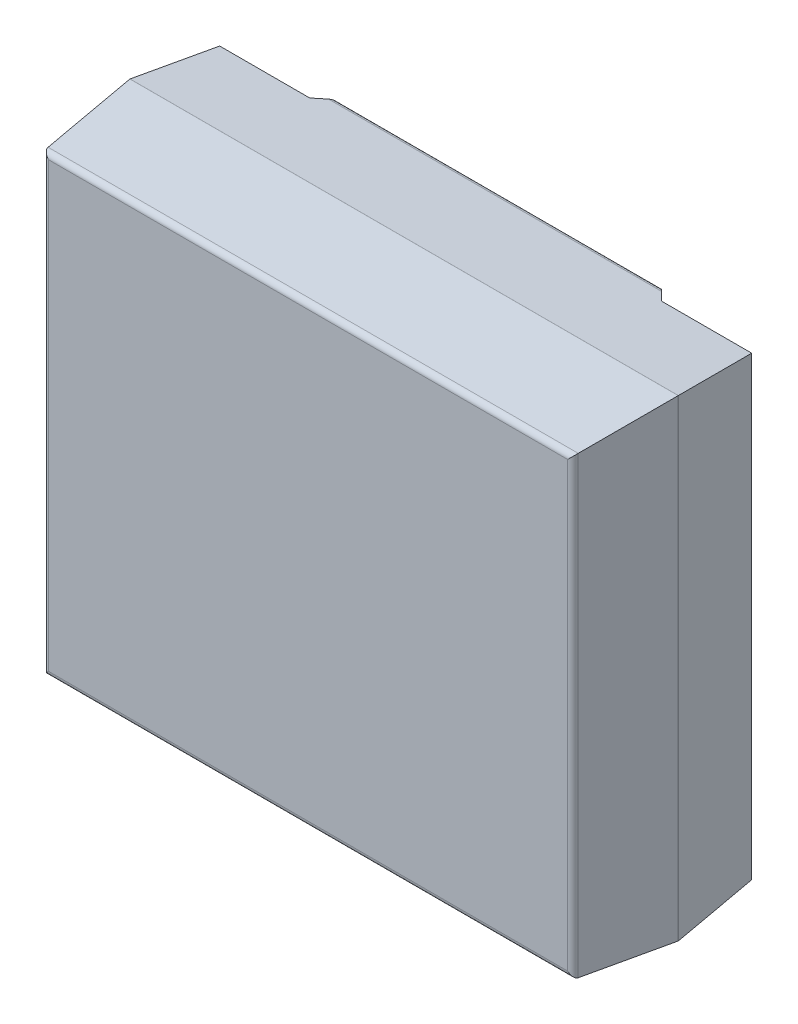
ISO-10303-21;
HEADER;
FILE_DESCRIPTION(('STEP AP214'),'2;1');
FILE_NAME('part.step','',(''),(''),'','','');
FILE_SCHEMA(('AUTOMOTIVE_DESIGN { 1 0 10303 214 1 1 1 1 }'));
ENDSEC;
DATA;
#1=APPLICATION_CONTEXT('core data for automotive mechanical design processes');
#2=APPLICATION_PROTOCOL_DEFINITION('international standard','automotive_design',2000,#1);
#3=PRODUCT_CONTEXT('',#1,'mechanical');
#4=PRODUCT('Part','Part','',(#3));
#5=PRODUCT_RELATED_PRODUCT_CATEGORY('part','',(#4));
#6=PRODUCT_DEFINITION_FORMATION('','',#4);
#7=PRODUCT_DEFINITION_CONTEXT('part definition',#1,'design');
#8=PRODUCT_DEFINITION('design','',#6,#7);
#9=PRODUCT_DEFINITION_SHAPE('','',#8);
#10=(LENGTH_UNIT() NAMED_UNIT(*) SI_UNIT(.MILLI.,.METRE.));
#11=(NAMED_UNIT(*) PLANE_ANGLE_UNIT() SI_UNIT($,.RADIAN.));
#12=(NAMED_UNIT(*) SI_UNIT($,.STERADIAN.) SOLID_ANGLE_UNIT());
#13=UNCERTAINTY_MEASURE_WITH_UNIT(LENGTH_MEASURE(1.E-05),#10,'distance_accuracy_value','');
#14=(GEOMETRIC_REPRESENTATION_CONTEXT(3) GLOBAL_UNCERTAINTY_ASSIGNED_CONTEXT((#13)) GLOBAL_UNIT_ASSIGNED_CONTEXT((#10,
#11,#12)) REPRESENTATION_CONTEXT('',''));
#15=CARTESIAN_POINT('',(0.,0.,0.));
#16=DIRECTION('',(0.,0.,1.));
#17=DIRECTION('',(1.,0.,0.));
#18=AXIS2_PLACEMENT_3D('',#15,#16,#17);
#19=CARTESIAN_POINT('',(91.200001657114,18.50000079233,0.28));
#20=DIRECTION('',(-0.707106781187046,-6.1817238459324E-08,0.707106781186046));
#21=DIRECTION('',(0.707106781186048,0.,0.707106781187047));
#22=AXIS2_PLACEMENT_3D('',#19,#20,#21);
#23=PLANE('',#22);
#24=DIRECTION('',(0.,1.,0.));
#25=VECTOR('',#24,1.);
#26=CARTESIAN_POINT('',(91.020001462091,20.547500899642,0.1));
#27=LINE('',#26,#25);
#28=CARTESIAN_POINT('',(91.0200014620913,20.730799729348,0.1));
#29=VERTEX_POINT('',#28);
#30=CARTESIAN_POINT('',(91.0200012200001,26.2692016472461,0.1));
#31=VERTEX_POINT('',#30);
#32=EDGE_CURVE('E135',#29,#31,#27,.T.);
#33=ORIENTED_EDGE('',*,*,#32,.T.);
#34=CARTESIAN_POINT('',(91.0900009779091,26.2692016533658,0.17));
#35=DIRECTION('',(-0.707106781187046,-6.1817238459324E-08,0.707106781186046));
#36=DIRECTION('',(0.707106781186044,6.18172378312038E-08,0.707106781187049));
#37=AXIS2_PLACEMENT_3D('',#34,#35,#36);
#38=ELLIPSE('',#37,0.0989949493660465,0.07);
#39=CARTESIAN_POINT('',(91.0830356934585,26.3388542542686,0.16303472163874));
#40=VERTEX_POINT('',#39);
#41=EDGE_CURVE('E20',#40,#31,#38,.T.);
#42=ORIENTED_EDGE('',*,*,#41,.F.);
#43=DIRECTION('',(-0.705345609691911,-0.0705346232461147,-0.705345615859258));
#44=VECTOR('',#43,1.);
#45=CARTESIAN_POINT('',(91.2000009707971,26.35055079233,0.279999999999937));
#46=LINE('',#45,#44);
#47=CARTESIAN_POINT('',(91.2000010538647,26.3505508662361,0.280000083067648));
#48=VERTEX_POINT('',#47);
#49=EDGE_CURVE('E109',#48,#40,#46,.T.);
#50=ORIENTED_EDGE('',*,*,#49,.F.);
#51=DIRECTION('',(0.,-1.,0.));
#52=VECTOR('',#51,1.);
#53=CARTESIAN_POINT('',(91.200000970797,18.500000949691,0.28));
#54=LINE('',#53,#52);
#55=CARTESIAN_POINT('',(91.2000012998202,20.6494507929799,0.279999996752506));
#56=VERTEX_POINT('',#55);
#57=EDGE_CURVE('E186',#48,#56,#54,.T.);
#58=ORIENTED_EDGE('',*,*,#57,.T.);
#59=DIRECTION('',(0.705345622024334,-0.0705344999244135,0.705345615859004));
#60=VECTOR('',#59,1.);
#61=CARTESIAN_POINT('',(91.0830362078494,20.661147308138,0.163034739668631));
#62=LINE('',#61,#60);
#63=CARTESIAN_POINT('',(91.0830362078494,20.6611473081379,0.163034739668682));
#64=VERTEX_POINT('',#63);
#65=EDGE_CURVE('E121',#64,#56,#62,.T.);
#66=ORIENTED_EDGE('',*,*,#65,.F.);
#67=CARTESIAN_POINT('',(91.0900014620915,20.7307999120614,0.17));
#68=DIRECTION('',(-0.707106781187046,-6.1817238459324E-08,0.707106781186046));
#69=DIRECTION('',(-0.707106781186044,-6.18172378312038E-08,-0.707106781187049));
#70=AXIS2_PLACEMENT_3D('',#67,#68,#69);
#71=ELLIPSE('',#70,0.0989949493660465,0.07);
#72=EDGE_CURVE('E184',#29,#64,#71,.T.);
#73=ORIENTED_EDGE('',*,*,#72,.F.);
#74=EDGE_LOOP('',(#33,#42,#50,#58,#66,#73));
#75=FACE_BOUND('',#74,.T.);
#76=ADVANCED_FACE('F17',(#75),#23,.F.);
#77=CARTESIAN_POINT('',(92.427501478116,20.547500899642,0.1));
#78=DIRECTION('',(0.,0.,1.));
#79=DIRECTION('',(1.,0.,0.));
#80=AXIS2_PLACEMENT_3D('',#77,#78,#79);
#81=PLANE('',#80);
#82=DIRECTION('',(0.999999999999996,8.74227765734797E-08,0.));
#83=VECTOR('',#82,1.);
#84=CARTESIAN_POINT('',(85.692450977909,26.2692011814968,0.1));
#85=LINE('',#84,#83);
#86=CARTESIAN_POINT('',(86.9800010989547,26.2692012925282,0.0999999394772857));
#87=VERTEX_POINT('',#86);
#88=EDGE_CURVE('E183',#31,#87,#85,.F.);
#89=ORIENTED_EDGE('',*,*,#88,.F.);
#90=ORIENTED_EDGE('',*,*,#32,.F.);
#91=DIRECTION('',(-0.999999999999996,-8.74227765734797E-08,0.));
#92=VECTOR('',#91,1.);
#93=CARTESIAN_POINT('',(92.307551462091,20.7308000185032,0.1));
#94=LINE('',#93,#92);
#95=CARTESIAN_POINT('',(86.9800014620916,20.730799551224,0.100000000000093));
#96=VERTEX_POINT('',#95);
#97=EDGE_CURVE('E187',#96,#29,#94,.F.);
#98=ORIENTED_EDGE('',*,*,#97,.F.);
#99=DIRECTION('',(-4.37113880647605E-08,0.999999999999998,-4.37113880646987E-08));
#100=VECTOR('',#99,1.);
#101=CARTESIAN_POINT('',(86.9800015596027,18.500000447456,0.100000097511696));
#102=LINE('',#101,#100);
#103=EDGE_CURVE('E139',#96,#87,#102,.T.);
#104=ORIENTED_EDGE('',*,*,#103,.T.);
#105=EDGE_LOOP('',(#89,#90,#98,#104));
#106=FACE_BOUND('',#105,.T.);
#107=ADVANCED_FACE('F542',(#106),#81,.F.);
#108=CARTESIAN_POINT('',(87.255099810316,18.500000447456,-0.175098153202));
#109=DIRECTION('',(0.707106781187046,6.1817237831294E-08,0.707106781186046));
#110=DIRECTION('',(0.707106781186048,0.,-0.707106781187047));
#111=AXIS2_PLACEMENT_3D('',#108,#109,#110);
#112=PLANE('',#111);
#113=CARTESIAN_POINT('',(86.9100009779094,26.2692012879386,0.17));
#114=DIRECTION('',(0.707106781187046,6.1817237831294E-08,0.707106781186046));
#115=DIRECTION('',(0.707106781186044,6.18172384592338E-08,-0.707106781187049));
#116=AXIS2_PLACEMENT_3D('',#113,#114,#115);
#117=ELLIPSE('',#116,0.0989949493660465,0.07);
#118=CARTESIAN_POINT('',(86.9169662321514,26.3388538918621,0.163034739668697));
#119=VERTEX_POINT('',#118);
#120=EDGE_CURVE('E130',#87,#119,#117,.T.);
#121=ORIENTED_EDGE('',*,*,#120,.F.);
#122=ORIENTED_EDGE('',*,*,#103,.F.);
#123=CARTESIAN_POINT('',(86.9100014620918,20.7307995466342,0.17));
#124=DIRECTION('',(0.707106781187046,6.1817237831294E-08,0.707106781186046));
#125=DIRECTION('',(-0.707106781186044,-6.18172384592338E-08,0.707106781187049));
#126=AXIS2_PLACEMENT_3D('',#123,#124,#125);
#127=ELLIPSE('',#126,0.0989949493660465,0.07);
#128=CARTESIAN_POINT('',(86.9169667465423,20.6611469457314,0.163034721638741));
#129=VERTEX_POINT('',#128);
#130=EDGE_CURVE('E188',#129,#96,#127,.T.);
#131=ORIENTED_EDGE('',*,*,#130,.F.);
#132=DIRECTION('',(0.705345609691932,0.0705346232461084,-0.705345615859237));
#133=VECTOR('',#132,1.);
#134=CARTESIAN_POINT('',(86.8000014692034,20.64945040767,0.280000000000383));
#135=LINE('',#134,#133);
#136=CARTESIAN_POINT('',(86.8000013861355,20.6494503665637,0.280000083067804));
#137=VERTEX_POINT('',#136);
#138=EDGE_CURVE('E137',#137,#129,#135,.T.);
#139=ORIENTED_EDGE('',*,*,#138,.F.);
#140=DIRECTION('',(0.,-1.,0.));
#141=VECTOR('',#140,1.);
#142=CARTESIAN_POINT('',(86.800001469203,18.50000040767,0.28));
#143=LINE('',#142,#141);
#144=CARTESIAN_POINT('',(86.80000114018,26.3505504070201,0.279999996752655));
#145=VERTEX_POINT('',#144);
#146=EDGE_CURVE('E182',#137,#145,#143,.F.);
#147=ORIENTED_EDGE('',*,*,#146,.T.);
#148=DIRECTION('',(-0.705345622024326,0.0705344999243709,0.705345615859017));
#149=VECTOR('',#148,1.);
#150=CARTESIAN_POINT('',(86.9169662321511,26.338853891862,0.163034739669071));
#151=LINE('',#150,#149);
#152=EDGE_CURVE('E190',#119,#145,#151,.T.);
#153=ORIENTED_EDGE('',*,*,#152,.F.);
#154=EDGE_LOOP('',(#121,#122,#131,#139,#147,#153));
#155=FACE_BOUND('',#154,.T.);
#156=ADVANCED_FACE('F534',(#155),#112,.F.);
#157=CARTESIAN_POINT('',(92.307551462091,20.730800018503,0.17));
#158=DIRECTION('',(-0.999999999999996,-8.74227765734797E-08,0.));
#159=DIRECTION('',(8.74227765734797E-08,-0.999999999999996,0.));
#160=AXIS2_PLACEMENT_3D('',#157,#158,#159);
#161=CYLINDRICAL_SURFACE('',#160,0.07);
#162=ORIENTED_EDGE('',*,*,#72,.T.);
#163=DIRECTION('',(0.999999999999996,8.65572045281956E-08,8.65572045281956E-09));
#164=VECTOR('',#163,1.);
#165=CARTESIAN_POINT('',(92.427501472873,20.6611474245114,0.163034751306337));
#166=LINE('',#165,#164);
#167=EDGE_CURVE('E206',#64,#129,#166,.F.);
#168=ORIENTED_EDGE('',*,*,#167,.T.);
#169=ORIENTED_EDGE('',*,*,#130,.T.);
#170=ORIENTED_EDGE('',*,*,#97,.T.);
#171=EDGE_LOOP('',(#162,#168,#169,#170));
#172=FACE_BOUND('',#171,.T.);
#173=ADVANCED_FACE('F526',(#172),#161,.T.);
#174=CARTESIAN_POINT('',(93.000001657114,18.500000949691,0.28));
#175=DIRECTION('',(0.,0.,1.));
#176=DIRECTION('',(0.,-1.,0.));
#177=AXIS2_PLACEMENT_3D('',#174,#175,#176);
#178=PLANE('',#177);
#179=DIRECTION('',(-8.65572045281956E-08,0.999999999999996,8.65572045281956E-09));
#180=VECTOR('',#179,1.);
#181=CARTESIAN_POINT('',(92.3255509619722,26.452500894398,0.280000000882477));
#182=LINE('',#181,#180);
#183=CARTESIAN_POINT('',(92.3255511366075,26.3505508900791,0.279999996752539));
#184=VERTEX_POINT('',#183);
#185=CARTESIAN_POINT('',(92.325551464268,20.6494508940189,0.27999996710194));
#186=VERTEX_POINT('',#185);
#187=EDGE_CURVE('E223',#184,#186,#182,.F.);
#188=ORIENTED_EDGE('',*,*,#187,.T.);
#189=DIRECTION('',(0.999999999999996,8.65572045281956E-08,8.65572045281956E-09));
#190=VECTOR('',#189,1.);
#191=CARTESIAN_POINT('',(92.427501472873,20.6494508995538,0.280000000882475));
#192=LINE('',#191,#190);
#193=EDGE_CURVE('E208',#186,#56,#192,.F.);
#194=ORIENTED_EDGE('',*,*,#193,.T.);
#195=ORIENTED_EDGE('',*,*,#57,.F.);
#196=DIRECTION('',(1.,0.,0.));
#197=VECTOR('',#196,1.);
#198=CARTESIAN_POINT('',(93.000001657114,26.350550890729,0.280000000000004));
#199=LINE('',#198,#197);
#200=EDGE_CURVE('E116',#184,#48,#199,.F.);
#201=ORIENTED_EDGE('',*,*,#200,.F.);
#202=EDGE_LOOP('',(#188,#194,#195,#201));
#203=FACE_BOUND('',#202,.T.);
#204=ADVANCED_FACE('F358',(#203),#178,.F.);
#205=CARTESIAN_POINT('',(85.692450977909,26.269201181497,0.17));
#206=DIRECTION('',(0.999999999999996,8.74227765734797E-08,0.));
#207=DIRECTION('',(-8.74227765734797E-08,0.999999999999996,0.));
#208=AXIS2_PLACEMENT_3D('',#205,#206,#207);
#209=CYLINDRICAL_SURFACE('',#208,0.07);
#210=DIRECTION('',(0.999999999999996,8.65572045281956E-08,-8.65572045281956E-09));
#211=VECTOR('',#210,1.);
#212=CARTESIAN_POINT('',(85.572500967127,26.3388537754886,0.163034751306337));
#213=LINE('',#212,#211);
#214=EDGE_CURVE('E114',#119,#40,#213,.T.);
#215=ORIENTED_EDGE('',*,*,#214,.T.);
#216=ORIENTED_EDGE('',*,*,#41,.T.);
#217=ORIENTED_EDGE('',*,*,#88,.T.);
#218=ORIENTED_EDGE('',*,*,#120,.T.);
#219=EDGE_LOOP('',(#215,#216,#217,#218));
#220=FACE_BOUND('',#219,.T.);
#221=ADVANCED_FACE('F126',(#220),#209,.T.);
#222=CARTESIAN_POINT('',(86.800001657114,18.50000040767,0.28));
#223=DIRECTION('',(0.,0.,1.));
#224=DIRECTION('',(0.,-1.,0.));
#225=AXIS2_PLACEMENT_3D('',#222,#223,#224);
#226=PLANE('',#225);
#227=DIRECTION('',(0.999999999999996,8.65572045281956E-08,-8.65572045281956E-09));
#228=VECTOR('',#227,1.);
#229=CARTESIAN_POINT('',(85.572500967127,26.3505503004462,0.280000000882476));
#230=LINE('',#229,#228);
#231=CARTESIAN_POINT('',(85.674450975732,26.3505503059811,0.279999967101939));
#232=VERTEX_POINT('',#231);
#233=EDGE_CURVE('E132',#232,#145,#230,.T.);
#234=ORIENTED_EDGE('',*,*,#233,.T.);
#235=ORIENTED_EDGE('',*,*,#146,.F.);
#236=DIRECTION('',(0.999999999999996,8.65572045281956E-08,8.65572045281956E-09));
#237=VECTOR('',#236,1.);
#238=CARTESIAN_POINT('',(92.427501472873,20.649450894771,0.280000048710099));
#239=LINE('',#238,#237);
#240=CARTESIAN_POINT('',(85.6744514695279,20.649450309596,0.279999996752545));
#241=VERTEX_POINT('',#240);
#242=EDGE_CURVE('E207',#137,#241,#239,.F.);
#243=ORIENTED_EDGE('',*,*,#242,.T.);
#244=DIRECTION('',(-8.65572045281956E-08,0.999999999999996,-8.65572045281956E-09));
#245=VECTOR('',#244,1.);
#246=CARTESIAN_POINT('',(85.6744514780277,20.547500305602,0.280000000882475));
#247=LINE('',#246,#245);
#248=EDGE_CURVE('E233',#241,#232,#247,.T.);
#249=ORIENTED_EDGE('',*,*,#248,.T.);
#250=EDGE_LOOP('',(#234,#235,#243,#249));
#251=FACE_BOUND('',#250,.T.);
#252=ADVANCED_FACE('F504',(#251),#226,.F.);
#253=CARTESIAN_POINT('',(92.427501472873,20.607475899642,0.69975));
#254=DIRECTION('',(-8.69889139620287E-08,0.995037190209985,0.0995037190209985));
#255=DIRECTION('',(0.,-0.0995037190209989,0.995037190209989));
#256=AXIS2_PLACEMENT_3D('',#253,#254,#255);
#257=PLANE('',#256);
#258=DIRECTION('',(0.999999999999996,8.74227765734797E-08,0.));
#259=VECTOR('',#258,1.);
#260=CARTESIAN_POINT('',(92.427501478116,20.547500899642,1.2995));
#261=LINE('',#260,#259);
#262=CARTESIAN_POINT('',(85.572501478116,20.5475003003584,1.29949999999999));
#263=VERTEX_POINT('',#262);
#264=CARTESIAN_POINT('',(92.4275014781155,20.547500899642,1.29950000000003));
#265=VERTEX_POINT('',#264);
#266=EDGE_CURVE('E180',#263,#265,#261,.T.);
#267=ORIENTED_EDGE('',*,*,#266,.F.);
#268=DIRECTION('',(0.0990147456415188,0.0990147629540551,-0.990147542976651));
#269=VECTOR('',#268,1.);
#270=CARTESIAN_POINT('',(85.572501478116,20.547500300358,1.2995));
#271=LINE('',#270,#269);
#272=EDGE_CURVE('E237',#263,#241,#271,.T.);
#273=ORIENTED_EDGE('',*,*,#272,.T.);
#274=ORIENTED_EDGE('',*,*,#242,.F.);
#275=ORIENTED_EDGE('',*,*,#138,.T.);
#276=ORIENTED_EDGE('',*,*,#167,.F.);
#277=ORIENTED_EDGE('',*,*,#65,.T.);
#278=ORIENTED_EDGE('',*,*,#193,.F.);
#279=DIRECTION('',(0.0990147629538225,-0.0990147456412828,0.990147542976697));
#280=VECTOR('',#279,1.);
#281=CARTESIAN_POINT('',(92.3255514692027,20.649450890729,0.280000000000026));
#282=LINE('',#281,#280);
#283=EDGE_CURVE('E226',#186,#265,#282,.T.);
#284=ORIENTED_EDGE('',*,*,#283,.T.);
#285=EDGE_LOOP('',(#267,#273,#274,#275,#276,#277,#278,#284));
#286=FACE_BOUND('',#285,.T.);
#287=ADVANCED_FACE('F341',(#286),#257,.F.);
#288=CARTESIAN_POINT('',(92.367525961884,26.452500894398,0.69975));
#289=DIRECTION('',(-0.995037190209985,-8.69889139620287E-08,0.0995037190209985));
#290=DIRECTION('',(0.0995037190209989,0.,0.995037190209989));
#291=AXIS2_PLACEMENT_3D('',#288,#289,#290);
#292=PLANE('',#291);
#293=DIRECTION('',(-8.74227765734797E-08,0.999999999999996,0.));
#294=VECTOR('',#293,1.);
#295=CARTESIAN_POINT('',(92.427500961884,26.452500899642,1.2995));
#296=LINE('',#295,#294);
#297=CARTESIAN_POINT('',(92.427500961884,26.4525008996411,1.29950000000003));
#298=VERTEX_POINT('',#297);
#299=EDGE_CURVE('E176',#265,#298,#296,.T.);
#300=ORIENTED_EDGE('',*,*,#299,.F.);
#301=ORIENTED_EDGE('',*,*,#283,.F.);
#302=ORIENTED_EDGE('',*,*,#187,.F.);
#303=DIRECTION('',(0.0990147456412764,0.0990147629538126,0.990147542976699));
#304=VECTOR('',#303,1.);
#305=CARTESIAN_POINT('',(92.325550970797,26.3505508907284,0.280000000000062));
#306=LINE('',#305,#304);
#307=EDGE_CURVE('E131',#184,#298,#306,.T.);
#308=ORIENTED_EDGE('',*,*,#307,.T.);
#309=EDGE_LOOP('',(#300,#301,#302,#308));
#310=FACE_BOUND('',#309,.T.);
#311=ADVANCED_FACE('F361',(#310),#292,.F.);
#312=CARTESIAN_POINT('',(85.572500967127,26.392525300358,0.69975));
#313=DIRECTION('',(8.69889139620287E-08,-0.995037190209985,0.0995037190209985));
#314=DIRECTION('',(0.,-0.0995037190209989,-0.995037190209989));
#315=AXIS2_PLACEMENT_3D('',#312,#313,#314);
#316=PLANE('',#315);
#317=ORIENTED_EDGE('',*,*,#307,.F.);
#318=ORIENTED_EDGE('',*,*,#200,.T.);
#319=ORIENTED_EDGE('',*,*,#49,.T.);
#320=ORIENTED_EDGE('',*,*,#214,.F.);
#321=ORIENTED_EDGE('',*,*,#152,.T.);
#322=ORIENTED_EDGE('',*,*,#233,.F.);
#323=DIRECTION('',(-0.0990147629538225,0.0990147456412795,0.990147542976697));
#324=VECTOR('',#323,1.);
#325=CARTESIAN_POINT('',(85.6744509707973,26.350550309271,0.280000000000026));
#326=LINE('',#325,#324);
#327=CARTESIAN_POINT('',(85.5725009618845,26.452500300358,1.29950000000003));
#328=VERTEX_POINT('',#327);
#329=EDGE_CURVE('E236',#232,#328,#326,.T.);
#330=ORIENTED_EDGE('',*,*,#329,.T.);
#331=DIRECTION('',(-0.999999999999996,-8.74227765734797E-08,0.));
#332=VECTOR('',#331,1.);
#333=CARTESIAN_POINT('',(85.572500961884,26.452500300358,1.2995));
#334=LINE('',#333,#332);
#335=EDGE_CURVE('E172',#298,#328,#334,.T.);
#336=ORIENTED_EDGE('',*,*,#335,.F.);
#337=EDGE_LOOP('',(#317,#318,#319,#320,#321,#322,#330,#336));
#338=FACE_BOUND('',#337,.T.);
#339=ADVANCED_FACE('F112',(#338),#316,.F.);
#340=CARTESIAN_POINT('',(85.632476478116,20.547500305602,0.69975));
#341=DIRECTION('',(0.995037190209985,8.69889139620287E-08,0.0995037190209985));
#342=DIRECTION('',(0.0995037190209989,0.,-0.995037190209989));
#343=AXIS2_PLACEMENT_3D('',#340,#341,#342);
#344=PLANE('',#343);
#345=ORIENTED_EDGE('',*,*,#248,.F.);
#346=ORIENTED_EDGE('',*,*,#272,.F.);
#347=DIRECTION('',(8.74227765734797E-08,-0.999999999999996,0.));
#348=VECTOR('',#347,1.);
#349=CARTESIAN_POINT('',(85.572501478116,20.547500300358,1.2995));
#350=LINE('',#349,#348);
#351=EDGE_CURVE('E168',#328,#263,#350,.T.);
#352=ORIENTED_EDGE('',*,*,#351,.F.);
#353=ORIENTED_EDGE('',*,*,#329,.F.);
#354=EDGE_LOOP('',(#345,#346,#352,#353));
#355=FACE_BOUND('',#354,.T.);
#356=ADVANCED_FACE('F336',(#355),#344,.F.);
#357=CARTESIAN_POINT('',(92.427501478116,20.547500899642,0.1));
#358=DIRECTION('',(8.74227765734797E-08,-0.999999999999996,0.));
#359=DIRECTION('',(0.999999999999996,8.74227765734797E-08,0.));
#360=AXIS2_PLACEMENT_3D('',#357,#358,#359);
#361=PLANE('',#360);
#362=DIRECTION('',(0.,0.,1.));
#363=VECTOR('',#362,1.);
#364=CARTESIAN_POINT('',(85.572501478116,20.547500300358,0.1));
#365=LINE('',#364,#363);
#366=CARTESIAN_POINT('',(85.5725014755604,20.5475002978024,1.30049997444396));
#367=VERTEX_POINT('',#366);
#368=EDGE_CURVE('E169',#263,#367,#365,.T.);
#369=ORIENTED_EDGE('',*,*,#368,.F.);
#370=ORIENTED_EDGE('',*,*,#266,.T.);
#371=DIRECTION('',(0.,0.,1.));
#372=VECTOR('',#371,1.);
#373=CARTESIAN_POINT('',(92.4275014781155,20.547500899642,0.1));
#374=LINE('',#373,#372);
#375=CARTESIAN_POINT('',(92.4275014810823,20.5475008966753,1.30049997033245));
#376=VERTEX_POINT('',#375);
#377=EDGE_CURVE('E177',#376,#265,#374,.F.);
#378=ORIENTED_EDGE('',*,*,#377,.F.);
#379=DIRECTION('',(0.999999999999996,8.65572045281956E-08,-8.65572045281956E-09));
#380=VECTOR('',#379,1.);
#381=CARTESIAN_POINT('',(92.427501472873,20.5475008937085,1.30049994066495));
#382=LINE('',#381,#380);
#383=EDGE_CURVE('E272',#367,#376,#382,.T.);
#384=ORIENTED_EDGE('',*,*,#383,.F.);
#385=EDGE_LOOP('',(#369,#370,#378,#384));
#386=FACE_BOUND('',#385,.T.);
#387=ADVANCED_FACE('F332',(#386),#361,.T.);
#388=CARTESIAN_POINT('',(92.427500961884,26.452500899642,0.1));
#389=DIRECTION('',(0.999999999999996,8.74227765734797E-08,0.));
#390=DIRECTION('',(-8.74227765734797E-08,0.999999999999996,0.));
#391=AXIS2_PLACEMENT_3D('',#388,#389,#390);
#392=PLANE('',#391);
#393=ORIENTED_EDGE('',*,*,#377,.T.);
#394=ORIENTED_EDGE('',*,*,#299,.T.);
#395=DIRECTION('',(0.,0.,1.));
#396=VECTOR('',#395,1.);
#397=CARTESIAN_POINT('',(92.427500961884,26.4525008996411,0.1));
#398=LINE('',#397,#396);
#399=CARTESIAN_POINT('',(92.4275009644396,26.4525009021967,1.30049997444392));
#400=VERTEX_POINT('',#399);
#401=EDGE_CURVE('E173',#400,#298,#398,.F.);
#402=ORIENTED_EDGE('',*,*,#401,.F.);
#403=DIRECTION('',(-8.65572045281956E-08,0.999999999999996,-8.65572045281956E-09));
#404=VECTOR('',#403,1.);
#405=CARTESIAN_POINT('',(92.4275009669952,26.452500894398,1.30049994888792));
#406=LINE('',#405,#404);
#407=EDGE_CURVE('E259',#376,#400,#406,.T.);
#408=ORIENTED_EDGE('',*,*,#407,.F.);
#409=EDGE_LOOP('',(#393,#394,#402,#408));
#410=FACE_BOUND('',#409,.T.);
#411=ADVANCED_FACE('F366',(#410),#392,.T.);
#412=CARTESIAN_POINT('',(85.572500961884,26.452500300358,0.1));
#413=DIRECTION('',(-8.74227765734797E-08,0.999999999999996,0.));
#414=DIRECTION('',(-0.999999999999996,-8.74227765734797E-08,0.));
#415=AXIS2_PLACEMENT_3D('',#412,#413,#414);
#416=PLANE('',#415);
#417=ORIENTED_EDGE('',*,*,#401,.T.);
#418=ORIENTED_EDGE('',*,*,#335,.T.);
#419=DIRECTION('',(0.,0.,1.));
#420=VECTOR('',#419,1.);
#421=CARTESIAN_POINT('',(85.5725009618845,26.452500300358,0.1));
#422=LINE('',#421,#420);
#423=CARTESIAN_POINT('',(85.5725009589177,26.4525003033248,1.30049997033245));
#424=VERTEX_POINT('',#423);
#425=EDGE_CURVE('E165',#424,#328,#422,.F.);
#426=ORIENTED_EDGE('',*,*,#425,.F.);
#427=DIRECTION('',(0.999999999999996,8.65572045281956E-08,8.65572045281956E-09));
#428=VECTOR('',#427,1.);
#429=CARTESIAN_POINT('',(85.572500967127,26.4525003062915,1.30049994066495));
#430=LINE('',#429,#428);
#431=EDGE_CURVE('E266',#400,#424,#430,.F.);
#432=ORIENTED_EDGE('',*,*,#431,.F.);
#433=EDGE_LOOP('',(#417,#418,#426,#432));
#434=FACE_BOUND('',#433,.T.);
#435=ADVANCED_FACE('F363',(#434),#416,.T.);
#436=CARTESIAN_POINT('',(85.572501478116,20.547500300358,0.1));
#437=DIRECTION('',(-0.999999999999996,-8.74227765734797E-08,0.));
#438=DIRECTION('',(8.74227765734797E-08,-0.999999999999996,0.));
#439=AXIS2_PLACEMENT_3D('',#436,#437,#438);
#440=PLANE('',#439);
#441=ORIENTED_EDGE('',*,*,#425,.T.);
#442=ORIENTED_EDGE('',*,*,#351,.T.);
#443=ORIENTED_EDGE('',*,*,#368,.T.);
#444=DIRECTION('',(-8.65572045281956E-08,0.999999999999996,8.65572045281956E-09));
#445=VECTOR('',#444,1.);
#446=CARTESIAN_POINT('',(85.5725014730048,20.547500305602,1.30049994888792));
#447=LINE('',#446,#445);
#448=EDGE_CURVE('E273',#424,#367,#447,.F.);
#449=ORIENTED_EDGE('',*,*,#448,.F.);
#450=EDGE_LOOP('',(#441,#442,#443,#449));
#451=FACE_BOUND('',#450,.T.);
#452=ADVANCED_FACE('F327',(#451),#440,.T.);
#453=CARTESIAN_POINT('',(92.427501472873,20.607475899642,1.90025));
#454=DIRECTION('',(8.69889139620287E-08,-0.995037190209985,0.0995037190209985));
#455=DIRECTION('',(0.,-0.0995037190209989,-0.995037190209989));
#456=AXIS2_PLACEMENT_3D('',#453,#454,#455);
#457=PLANE('',#456);
#458=ORIENTED_EDGE('',*,*,#383,.T.);
#459=DIRECTION('',(0.0990147629538334,-0.0990147456408201,-0.990147542976742));
#460=VECTOR('',#459,1.);
#461=CARTESIAN_POINT('',(92.3138549421471,20.661147415739,2.43696526033101));
#462=LINE('',#461,#460);
#463=CARTESIAN_POINT('',(92.3138549421473,20.6611474157393,2.43696526033124));
#464=VERTEX_POINT('',#463);
#465=EDGE_CURVE('E263',#464,#376,#462,.T.);
#466=ORIENTED_EDGE('',*,*,#465,.F.);
#467=DIRECTION('',(-0.999999999999996,-8.74227765734797E-08,0.));
#468=VECTOR('',#467,1.);
#469=CARTESIAN_POINT('',(92.3075514681802,20.6611474151883,2.43696526033102));
#470=LINE('',#469,#468);
#471=CARTESIAN_POINT('',(85.6861479942136,20.6611468363269,2.43696526033125));
#472=VERTEX_POINT('',#471);
#473=EDGE_CURVE('E164',#472,#464,#470,.F.);
#474=ORIENTED_EDGE('',*,*,#473,.F.);
#475=DIRECTION('',(0.0990147456415184,0.0990147629543412,0.990147542976622));
#476=VECTOR('',#475,1.);
#477=CARTESIAN_POINT('',(85.572501478116,20.547500300358,1.3005));
#478=LINE('',#477,#476);
#479=EDGE_CURVE('E276',#367,#472,#478,.T.);
#480=ORIENTED_EDGE('',*,*,#479,.F.);
#481=EDGE_LOOP('',(#458,#466,#474,#480));
#482=FACE_BOUND('',#481,.T.);
#483=ADVANCED_FACE('F368',(#482),#457,.T.);
#484=CARTESIAN_POINT('',(92.367525961884,26.452500894398,1.90025));
#485=DIRECTION('',(0.995037190209985,8.69889139620287E-08,0.0995037190209985));
#486=DIRECTION('',(0.0995037190209989,0.,-0.995037190209989));
#487=AXIS2_PLACEMENT_3D('',#484,#485,#486);
#488=PLANE('',#487);
#489=ORIENTED_EDGE('',*,*,#407,.T.);
#490=DIRECTION('',(0.0990147456408173,0.0990147629538185,-0.990147542976744));
#491=VECTOR('',#490,1.);
#492=CARTESIAN_POINT('',(92.313854445787,26.3388543636727,2.43696526033097));
#493=LINE('',#492,#491);
#494=CARTESIAN_POINT('',(92.3138544457867,26.338854363673,2.43696526033126));
#495=VERTEX_POINT('',#494);
#496=EDGE_CURVE('E262',#495,#400,#493,.T.);
#497=ORIENTED_EDGE('',*,*,#496,.F.);
#498=DIRECTION('',(8.74227765734797E-08,-0.999999999999996,0.));
#499=VECTOR('',#498,1.);
#500=CARTESIAN_POINT('',(92.3138544463377,26.3325508897062,2.43696526033106));
#501=LINE('',#500,#499);
#502=EDGE_CURVE('E160',#464,#495,#501,.F.);
#503=ORIENTED_EDGE('',*,*,#502,.F.);
#504=ORIENTED_EDGE('',*,*,#465,.T.);
#505=EDGE_LOOP('',(#489,#497,#503,#504));
#506=FACE_BOUND('',#505,.T.);
#507=ADVANCED_FACE('F367',(#506),#488,.T.);
#508=CARTESIAN_POINT('',(85.572500967127,26.392525300358,1.90025));
#509=DIRECTION('',(-8.69889139620287E-08,0.995037190209985,0.0995037190209985));
#510=DIRECTION('',(0.,-0.0995037190209989,0.995037190209989));
#511=AXIS2_PLACEMENT_3D('',#508,#509,#510);
#512=PLANE('',#511);
#513=ORIENTED_EDGE('',*,*,#431,.T.);
#514=DIRECTION('',(-0.0990147629538334,0.0990147456408171,-0.990147542976743));
#515=VECTOR('',#514,1.);
#516=CARTESIAN_POINT('',(85.6861474978529,26.338853784261,2.43696526033101));
#517=LINE('',#516,#515);
#518=CARTESIAN_POINT('',(85.6861474978527,26.3388537842607,2.43696526033124));
#519=VERTEX_POINT('',#518);
#520=EDGE_CURVE('E269',#519,#424,#517,.T.);
#521=ORIENTED_EDGE('',*,*,#520,.F.);
#522=DIRECTION('',(0.999999999999996,8.74227765734797E-08,0.));
#523=VECTOR('',#522,1.);
#524=CARTESIAN_POINT('',(85.6924509718198,26.3388537848117,2.43696526033102));
#525=LINE('',#524,#523);
#526=EDGE_CURVE('E156',#495,#519,#525,.F.);
#527=ORIENTED_EDGE('',*,*,#526,.F.);
#528=ORIENTED_EDGE('',*,*,#496,.T.);
#529=EDGE_LOOP('',(#513,#521,#527,#528));
#530=FACE_BOUND('',#529,.T.);
#531=ADVANCED_FACE('F323',(#530),#512,.T.);
#532=CARTESIAN_POINT('',(85.632476478116,20.547500305602,1.90025));
#533=DIRECTION('',(-0.995037190209985,-8.69889139620287E-08,0.0995037190209985));
#534=DIRECTION('',(0.0995037190209989,0.,0.995037190209989));
#535=AXIS2_PLACEMENT_3D('',#532,#533,#534);
#536=PLANE('',#535);
#537=ORIENTED_EDGE('',*,*,#448,.T.);
#538=ORIENTED_EDGE('',*,*,#479,.T.);
#539=DIRECTION('',(-8.74227765734797E-08,0.999999999999996,0.));
#540=VECTOR('',#539,1.);
#541=CARTESIAN_POINT('',(85.6861479936623,20.6674503102938,2.43696526033106));
#542=LINE('',#541,#540);
#543=EDGE_CURVE('E154',#519,#472,#542,.F.);
#544=ORIENTED_EDGE('',*,*,#543,.F.);
#545=ORIENTED_EDGE('',*,*,#520,.T.);
#546=EDGE_LOOP('',(#537,#538,#544,#545));
#547=FACE_BOUND('',#546,.T.);
#548=ADVANCED_FACE('F306',(#547),#536,.T.);
#549=CARTESIAN_POINT('',(92.307551462091,20.730800018503,2.43));
#550=DIRECTION('',(-0.999999999999996,-8.74227765734797E-08,0.));
#551=DIRECTION('',(8.74227765734797E-08,-0.999999999999996,0.));
#552=AXIS2_PLACEMENT_3D('',#549,#550,#551);
#553=CYLINDRICAL_SURFACE('',#552,0.07);
#554=CARTESIAN_POINT('',(85.7558005914389,20.7307994457307,2.43));
#555=DIRECTION('',(-0.707106843003783,0.707106719369307,0.));
#556=DIRECTION('',(0.707106719369307,0.707106843003783,0.));
#557=AXIS2_PLACEMENT_3D('',#554,#555,#556);
#558=ELLIPSE('',#557,0.0989949493661167,0.07);
#559=CARTESIAN_POINT('',(85.755800349348,20.730799445731,2.5));
#560=VERTEX_POINT('',#559);
#561=EDGE_CURVE('E150',#472,#560,#558,.T.);
#562=ORIENTED_EDGE('',*,*,#561,.F.);
#563=ORIENTED_EDGE('',*,*,#473,.T.);
#564=CARTESIAN_POINT('',(92.2442023327436,20.7308000129648,2.43));
#565=DIRECTION('',(-0.707106719369307,-0.707106843003783,0.));
#566=DIRECTION('',(0.707106843003783,-0.707106719369307,0.));
#567=AXIS2_PLACEMENT_3D('',#564,#565,#566);
#568=ELLIPSE('',#567,0.0989949493661167,0.07);
#569=CARTESIAN_POINT('',(92.2442024036474,20.7307996584439,2.49999999999993));
#570=VERTEX_POINT('',#569);
#571=EDGE_CURVE('E161',#570,#464,#568,.F.);
#572=ORIENTED_EDGE('',*,*,#571,.F.);
#573=DIRECTION('',(1.,0.,0.));
#574=VECTOR('',#573,1.);
#575=CARTESIAN_POINT('',(92.427501478116,20.730799445731,2.5));
#576=LINE('',#575,#574);
#577=EDGE_CURVE('E153',#560,#570,#576,.T.);
#578=ORIENTED_EDGE('',*,*,#577,.F.);
#579=EDGE_LOOP('',(#562,#563,#572,#578));
#580=FACE_BOUND('',#579,.T.);
#581=ADVANCED_FACE('F312',(#580),#553,.T.);
#582=CARTESIAN_POINT('',(92.244201843023,26.332550883617,2.43));
#583=DIRECTION('',(8.74227765734797E-08,-0.999999999999996,0.));
#584=DIRECTION('',(0.999999999999996,8.74227765734797E-08,0.));
#585=AXIS2_PLACEMENT_3D('',#582,#583,#584);
#586=CYLINDRICAL_SURFACE('',#585,0.07);
#587=ORIENTED_EDGE('',*,*,#571,.T.);
#588=ORIENTED_EDGE('',*,*,#502,.T.);
#589=CARTESIAN_POINT('',(92.2442018485612,26.2692017542693,2.43));
#590=DIRECTION('',(0.707106843003783,-0.707106719369307,0.));
#591=DIRECTION('',(0.707106719369307,0.707106843003783,0.));
#592=AXIS2_PLACEMENT_3D('',#589,#590,#591);
#593=ELLIPSE('',#592,0.0989949493661167,0.07);
#594=CARTESIAN_POINT('',(92.2442021511747,26.2692018147918,2.49999999999995));
#595=VERTEX_POINT('',#594);
#596=EDGE_CURVE('E157',#595,#495,#593,.F.);
#597=ORIENTED_EDGE('',*,*,#596,.F.);
#598=DIRECTION('',(0.,1.,0.));
#599=VECTOR('',#598,1.);
#600=CARTESIAN_POINT('',(92.244202332743,20.547500899642,2.5));
#601=LINE('',#600,#599);
#602=EDGE_CURVE('E291',#570,#595,#601,.T.);
#603=ORIENTED_EDGE('',*,*,#602,.F.);
#604=EDGE_LOOP('',(#587,#588,#597,#603));
#605=FACE_BOUND('',#604,.T.);
#606=ADVANCED_FACE('F320',(#605),#586,.T.);
#607=CARTESIAN_POINT('',(85.692450977909,26.269201181497,2.43));
#608=DIRECTION('',(0.999999999999996,8.74227765734797E-08,0.));
#609=DIRECTION('',(-8.74227765734797E-08,0.999999999999996,0.));
#610=AXIS2_PLACEMENT_3D('',#607,#608,#609);
#611=CYLINDRICAL_SURFACE('',#610,0.07);
#612=ORIENTED_EDGE('',*,*,#526,.T.);
#613=CARTESIAN_POINT('',(85.7558001072564,26.2692011870352,2.43));
#614=DIRECTION('',(0.707106719369307,0.707106843003783,0.));
#615=DIRECTION('',(-0.707106843003783,0.707106719369307,0.));
#616=AXIS2_PLACEMENT_3D('',#613,#614,#615);
#617=ELLIPSE('',#616,0.0989949493661166,0.07);
#618=CARTESIAN_POINT('',(85.7558000363526,26.2692015415561,2.49999999999993));
#619=VERTEX_POINT('',#618);
#620=EDGE_CURVE('E35',#619,#519,#617,.F.);
#621=ORIENTED_EDGE('',*,*,#620,.F.);
#622=DIRECTION('',(1.,0.,0.));
#623=VECTOR('',#622,1.);
#624=CARTESIAN_POINT('',(92.427501478116,26.269201754269,2.5));
#625=LINE('',#624,#623);
#626=EDGE_CURVE('E26',#595,#619,#625,.F.);
#627=ORIENTED_EDGE('',*,*,#626,.F.);
#628=ORIENTED_EDGE('',*,*,#596,.T.);
#629=EDGE_LOOP('',(#612,#621,#627,#628));
#630=FACE_BOUND('',#629,.T.);
#631=ADVANCED_FACE('F317',(#630),#611,.T.);
#632=CARTESIAN_POINT('',(85.755800596977,20.667450316383,2.43));
#633=DIRECTION('',(-8.74227765734797E-08,0.999999999999996,0.));
#634=DIRECTION('',(-0.999999999999996,-8.74227765734797E-08,0.));
#635=AXIS2_PLACEMENT_3D('',#632,#633,#634);
#636=CYLINDRICAL_SURFACE('',#635,0.07);
#637=ORIENTED_EDGE('',*,*,#543,.T.);
#638=ORIENTED_EDGE('',*,*,#561,.T.);
#639=DIRECTION('',(0.,1.,0.));
#640=VECTOR('',#639,1.);
#641=CARTESIAN_POINT('',(85.755800107257,20.547500899642,2.5));
#642=LINE('',#641,#640);
#643=EDGE_CURVE('E11',#619,#560,#642,.F.);
#644=ORIENTED_EDGE('',*,*,#643,.F.);
#645=ORIENTED_EDGE('',*,*,#620,.T.);
#646=EDGE_LOOP('',(#637,#638,#644,#645));
#647=FACE_BOUND('',#646,.T.);
#648=ADVANCED_FACE('F302',(#647),#636,.T.);
#649=CARTESIAN_POINT('',(92.427501478116,20.547500899642,2.5));
#650=DIRECTION('',(0.,0.,1.));
#651=DIRECTION('',(1.,0.,0.));
#652=AXIS2_PLACEMENT_3D('',#649,#650,#651);
#653=PLANE('',#652);
#654=ORIENTED_EDGE('',*,*,#626,.T.);
#655=ORIENTED_EDGE('',*,*,#643,.T.);
#656=ORIENTED_EDGE('',*,*,#577,.T.);
#657=ORIENTED_EDGE('',*,*,#602,.T.);
#658=EDGE_LOOP('',(#654,#655,#656,#657));
#659=FACE_BOUND('',#658,.T.);
#660=ADVANCED_FACE('F316',(#659),#653,.T.);
#661=CLOSED_SHELL('',(#76,#107,#156,#173,#204,#221,#252,#287,#311,#339,#356,#387,#411,#435,#452,
#483,#507,#531,#548,#581,#606,#631,#648,#660));
#662=MANIFOLD_SOLID_BREP('B1',#661);
#663=ADVANCED_BREP_SHAPE_REPRESENTATION('',(#18,#662),#14);
#664=SHAPE_DEFINITION_REPRESENTATION(#9,#663);
ENDSEC;
END-ISO-10303-21;
